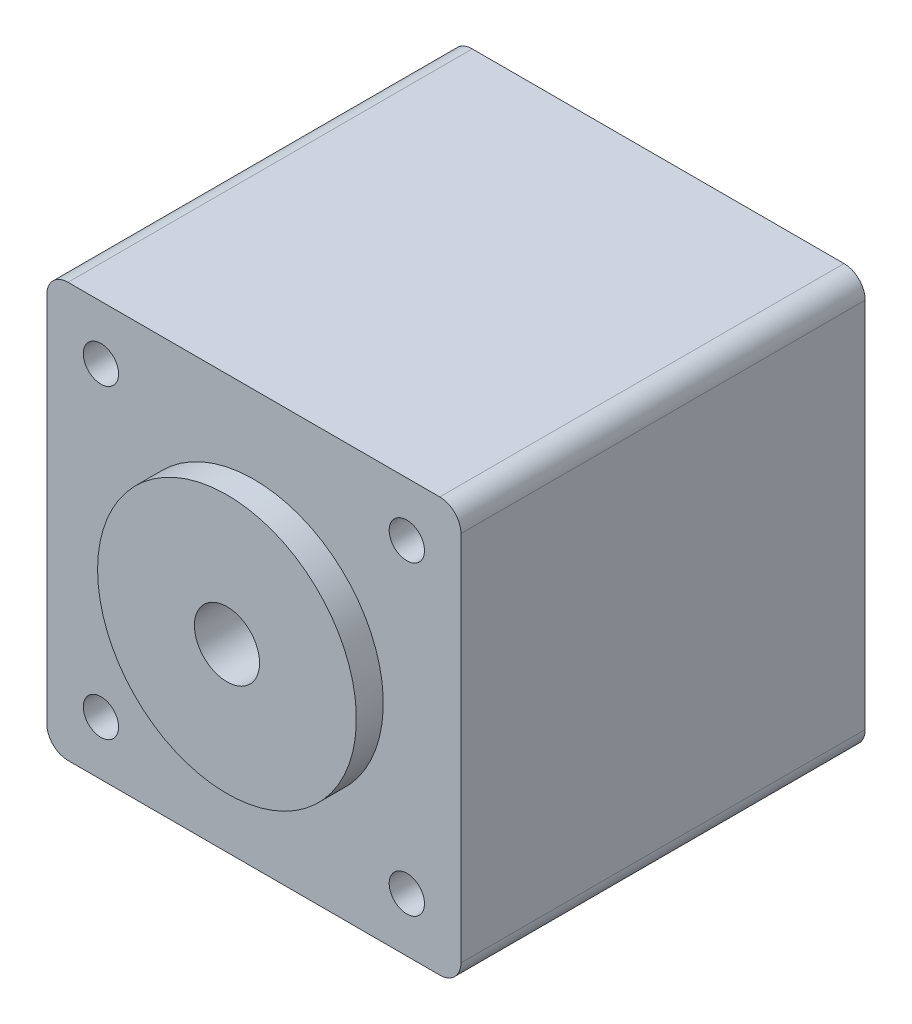
ISO-10303-21;
HEADER;
FILE_DESCRIPTION(('STEP AP214'),'2;1');
FILE_NAME('part.step','',(''),(''),'','','');
FILE_SCHEMA(('AUTOMOTIVE_DESIGN { 1 0 10303 214 1 1 1 1 }'));
ENDSEC;
DATA;
#1=APPLICATION_CONTEXT('core data for automotive mechanical design processes');
#2=APPLICATION_PROTOCOL_DEFINITION('international standard','automotive_design',2000,#1);
#3=PRODUCT_CONTEXT('',#1,'mechanical');
#4=PRODUCT('Part','Part','',(#3));
#5=PRODUCT_RELATED_PRODUCT_CATEGORY('part','',(#4));
#6=PRODUCT_DEFINITION_FORMATION('','',#4);
#7=PRODUCT_DEFINITION_CONTEXT('part definition',#1,'design');
#8=PRODUCT_DEFINITION('design','',#6,#7);
#9=PRODUCT_DEFINITION_SHAPE('','',#8);
#10=(LENGTH_UNIT() NAMED_UNIT(*) SI_UNIT(.MILLI.,.METRE.));
#11=(NAMED_UNIT(*) PLANE_ANGLE_UNIT() SI_UNIT($,.RADIAN.));
#12=(NAMED_UNIT(*) SI_UNIT($,.STERADIAN.) SOLID_ANGLE_UNIT());
#13=UNCERTAINTY_MEASURE_WITH_UNIT(LENGTH_MEASURE(1.E-05),#10,'distance_accuracy_value','');
#14=(GEOMETRIC_REPRESENTATION_CONTEXT(3) GLOBAL_UNCERTAINTY_ASSIGNED_CONTEXT((#13)) GLOBAL_UNIT_ASSIGNED_CONTEXT((#10,
#11,#12)) REPRESENTATION_CONTEXT('',''));
#15=CARTESIAN_POINT('',(0.,0.,0.));
#16=DIRECTION('',(0.,0.,1.));
#17=DIRECTION('',(1.,0.,0.));
#18=AXIS2_PLACEMENT_3D('',#15,#16,#17);
#19=CARTESIAN_POINT('',(-4.51548307073138,-24.425,-32.7865505037473));
#20=DIRECTION('',(0.,-1.,0.));
#21=DIRECTION('',(0.,0.,-1.));
#22=AXIS2_PLACEMENT_3D('',#19,#20,#21);
#23=PLANE('',#22);
#24=CARTESIAN_POINT('',(-0.499999999999994,-24.425,-29.61));
#25=DIRECTION('',(0.,1.,0.));
#26=DIRECTION('',(0.,0.,1.));
#27=AXIS2_PLACEMENT_3D('',#24,#25,#26);
#28=CIRCLE('',#27,0.634999999999997);
#29=CARTESIAN_POINT('',(-0.499999999999994,-24.425,-28.975));
#30=VERTEX_POINT('',#29);
#31=EDGE_CURVE('E20',#30,#30,#28,.T.);
#32=ORIENTED_EDGE('',*,*,#31,.F.);
#33=EDGE_LOOP('',(#32));
#34=FACE_BOUND('',#33,.T.);
#35=ADVANCED_FACE('F17',(#34),#23,.T.);
#36=CARTESIAN_POINT('',(-4.51548307073138,-24.425,-32.7865505037473));
#37=DIRECTION('',(0.,-1.,0.));
#38=DIRECTION('',(0.,0.,-1.));
#39=AXIS2_PLACEMENT_3D('',#36,#37,#38);
#40=PLANE('',#39);
#41=CARTESIAN_POINT('',(-1.49999999999999,-24.425,-28.61));
#42=DIRECTION('',(0.,1.,0.));
#43=DIRECTION('',(0.,0.,1.));
#44=AXIS2_PLACEMENT_3D('',#41,#42,#43);
#45=CIRCLE('',#44,0.634999999999997);
#46=CARTESIAN_POINT('',(-1.49999999999999,-24.425,-27.975));
#47=VERTEX_POINT('',#46);
#48=EDGE_CURVE('E225',#47,#47,#45,.T.);
#49=ORIENTED_EDGE('',*,*,#48,.F.);
#50=EDGE_LOOP('',(#49));
#51=FACE_BOUND('',#50,.T.);
#52=ADVANCED_FACE('F236',(#51),#40,.T.);
#53=CARTESIAN_POINT('',(-4.51548307073138,-24.425,-32.7865505037473));
#54=DIRECTION('',(0.,-1.,0.));
#55=DIRECTION('',(0.,0.,-1.));
#56=AXIS2_PLACEMENT_3D('',#53,#54,#55);
#57=PLANE('',#56);
#58=CARTESIAN_POINT('',(0.500000000000007,-24.425,-28.61));
#59=DIRECTION('',(0.,1.,0.));
#60=DIRECTION('',(0.,0.,1.));
#61=AXIS2_PLACEMENT_3D('',#58,#59,#60);
#62=CIRCLE('',#61,0.634999999999997);
#63=CARTESIAN_POINT('',(0.500000000000007,-24.425,-27.975));
#64=VERTEX_POINT('',#63);
#65=EDGE_CURVE('E223',#64,#64,#62,.T.);
#66=ORIENTED_EDGE('',*,*,#65,.F.);
#67=EDGE_LOOP('',(#66));
#68=FACE_BOUND('',#67,.T.);
#69=ADVANCED_FACE('F241',(#68),#57,.T.);
#70=CARTESIAN_POINT('',(-4.51548307073138,-24.425,-32.7865505037473));
#71=DIRECTION('',(0.,-1.,0.));
#72=DIRECTION('',(0.,0.,-1.));
#73=AXIS2_PLACEMENT_3D('',#70,#71,#72);
#74=PLANE('',#73);
#75=CARTESIAN_POINT('',(1.50000000000001,-24.425,-29.61));
#76=DIRECTION('',(0.,1.,0.));
#77=DIRECTION('',(0.,0.,1.));
#78=AXIS2_PLACEMENT_3D('',#75,#76,#77);
#79=CIRCLE('',#78,0.634999999999997);
#80=CARTESIAN_POINT('',(1.50000000000001,-24.425,-28.975));
#81=VERTEX_POINT('',#80);
#82=EDGE_CURVE('E220',#81,#81,#79,.T.);
#83=ORIENTED_EDGE('',*,*,#82,.F.);
#84=EDGE_LOOP('',(#83));
#85=FACE_BOUND('',#84,.T.);
#86=ADVANCED_FACE('F365',(#85),#74,.T.);
#87=CARTESIAN_POINT('',(-0.499999999999994,-39.425,-29.61));
#88=DIRECTION('',(0.,1.,0.));
#89=DIRECTION('',(0.,0.,1.));
#90=AXIS2_PLACEMENT_3D('',#87,#88,#89);
#91=CYLINDRICAL_SURFACE('',#90,0.634999999999997);
#92=ORIENTED_EDGE('',*,*,#31,.T.);
#93=EDGE_LOOP('',(#92));
#94=FACE_BOUND('',#93,.T.);
#95=CARTESIAN_POINT('',(-0.499999999999994,-14.425,-29.61));
#96=DIRECTION('',(0.,1.,0.));
#97=DIRECTION('',(0.,0.,1.));
#98=AXIS2_PLACEMENT_3D('',#95,#96,#97);
#99=CIRCLE('',#98,0.634999999999997);
#100=CARTESIAN_POINT('',(-0.499999999999994,-14.425,-28.975));
#101=VERTEX_POINT('',#100);
#102=EDGE_CURVE('E214',#101,#101,#99,.F.);
#103=ORIENTED_EDGE('',*,*,#102,.T.);
#104=EDGE_LOOP('',(#103));
#105=FACE_BOUND('',#104,.T.);
#106=ADVANCED_FACE('F232',(#94,#105),#91,.T.);
#107=CARTESIAN_POINT('',(-1.49999999999999,-39.425,-28.61));
#108=DIRECTION('',(0.,1.,0.));
#109=DIRECTION('',(0.,0.,1.));
#110=AXIS2_PLACEMENT_3D('',#107,#108,#109);
#111=CYLINDRICAL_SURFACE('',#110,0.634999999999997);
#112=ORIENTED_EDGE('',*,*,#48,.T.);
#113=EDGE_LOOP('',(#112));
#114=FACE_BOUND('',#113,.T.);
#115=CARTESIAN_POINT('',(-1.49999999999999,-14.425,-28.61));
#116=DIRECTION('',(0.,1.,0.));
#117=DIRECTION('',(0.,0.,1.));
#118=AXIS2_PLACEMENT_3D('',#115,#116,#117);
#119=CIRCLE('',#118,0.634999999999997);
#120=CARTESIAN_POINT('',(-1.49999999999999,-14.425,-27.975));
#121=VERTEX_POINT('',#120);
#122=EDGE_CURVE('E211',#121,#121,#119,.F.);
#123=ORIENTED_EDGE('',*,*,#122,.T.);
#124=EDGE_LOOP('',(#123));
#125=FACE_BOUND('',#124,.T.);
#126=ADVANCED_FACE('F359',(#114,#125),#111,.T.);
#127=CARTESIAN_POINT('',(0.500000000000007,-39.425,-28.61));
#128=DIRECTION('',(0.,1.,0.));
#129=DIRECTION('',(0.,0.,1.));
#130=AXIS2_PLACEMENT_3D('',#127,#128,#129);
#131=CYLINDRICAL_SURFACE('',#130,0.634999999999997);
#132=ORIENTED_EDGE('',*,*,#65,.T.);
#133=EDGE_LOOP('',(#132));
#134=FACE_BOUND('',#133,.T.);
#135=CARTESIAN_POINT('',(0.500000000000007,-14.425,-28.61));
#136=DIRECTION('',(0.,1.,0.));
#137=DIRECTION('',(0.,0.,1.));
#138=AXIS2_PLACEMENT_3D('',#135,#136,#137);
#139=CIRCLE('',#138,0.634999999999997);
#140=CARTESIAN_POINT('',(0.500000000000007,-14.425,-27.975));
#141=VERTEX_POINT('',#140);
#142=EDGE_CURVE('E208',#141,#141,#139,.F.);
#143=ORIENTED_EDGE('',*,*,#142,.T.);
#144=EDGE_LOOP('',(#143));
#145=FACE_BOUND('',#144,.T.);
#146=ADVANCED_FACE('F355',(#134,#145),#131,.T.);
#147=CARTESIAN_POINT('',(1.50000000000001,-39.425,-29.61));
#148=DIRECTION('',(0.,1.,0.));
#149=DIRECTION('',(0.,0.,1.));
#150=AXIS2_PLACEMENT_3D('',#147,#148,#149);
#151=CYLINDRICAL_SURFACE('',#150,0.634999999999997);
#152=ORIENTED_EDGE('',*,*,#82,.T.);
#153=EDGE_LOOP('',(#152));
#154=FACE_BOUND('',#153,.T.);
#155=CARTESIAN_POINT('',(1.50000000000001,-14.425,-29.61));
#156=DIRECTION('',(0.,1.,0.));
#157=DIRECTION('',(0.,0.,1.));
#158=AXIS2_PLACEMENT_3D('',#155,#156,#157);
#159=CIRCLE('',#158,0.634999999999997);
#160=CARTESIAN_POINT('',(1.50000000000001,-14.425,-28.975));
#161=VERTEX_POINT('',#160);
#162=EDGE_CURVE('E205',#161,#161,#159,.F.);
#163=ORIENTED_EDGE('',*,*,#162,.T.);
#164=EDGE_LOOP('',(#163));
#165=FACE_BOUND('',#164,.T.);
#166=ADVANCED_FACE('F351',(#154,#165),#151,.T.);
#167=CARTESIAN_POINT('',(-13.,-13.,-3.81));
#168=DIRECTION('',(0.,0.,1.));
#169=DIRECTION('',(1.,0.,0.));
#170=AXIS2_PLACEMENT_3D('',#167,#168,#169);
#171=PLANE('',#170);
#172=CARTESIAN_POINT('',(-13.,-13.,-3.81));
#173=DIRECTION('',(0.,0.,1.));
#174=DIRECTION('',(1.,0.,0.));
#175=AXIS2_PLACEMENT_3D('',#172,#173,#174);
#176=CIRCLE('',#175,1.5);
#177=CARTESIAN_POINT('',(-11.5,-13.,-3.81));
#178=VERTEX_POINT('',#177);
#179=EDGE_CURVE('E202',#178,#178,#176,.T.);
#180=ORIENTED_EDGE('',*,*,#179,.T.);
#181=EDGE_LOOP('',(#180));
#182=FACE_BOUND('',#181,.T.);
#183=ADVANCED_FACE('F347',(#182),#171,.T.);
#184=CARTESIAN_POINT('',(13.,-12.9999999999998,-3.81));
#185=DIRECTION('',(0.,0.,1.));
#186=DIRECTION('',(1.,0.,0.));
#187=AXIS2_PLACEMENT_3D('',#184,#185,#186);
#188=PLANE('',#187);
#189=CARTESIAN_POINT('',(13.,-12.9999999999998,-3.81));
#190=DIRECTION('',(0.,0.,1.));
#191=DIRECTION('',(1.,0.,0.));
#192=AXIS2_PLACEMENT_3D('',#189,#190,#191);
#193=CIRCLE('',#192,1.5);
#194=CARTESIAN_POINT('',(14.5,-12.9999999999998,-3.81));
#195=VERTEX_POINT('',#194);
#196=EDGE_CURVE('E199',#195,#195,#193,.T.);
#197=ORIENTED_EDGE('',*,*,#196,.T.);
#198=EDGE_LOOP('',(#197));
#199=FACE_BOUND('',#198,.T.);
#200=ADVANCED_FACE('F343',(#199),#188,.T.);
#201=CARTESIAN_POINT('',(13.,13.0000000000002,-3.81));
#202=DIRECTION('',(0.,0.,1.));
#203=DIRECTION('',(1.,0.,0.));
#204=AXIS2_PLACEMENT_3D('',#201,#202,#203);
#205=PLANE('',#204);
#206=CARTESIAN_POINT('',(13.,13.0000000000002,-3.81));
#207=DIRECTION('',(0.,0.,1.));
#208=DIRECTION('',(1.,0.,0.));
#209=AXIS2_PLACEMENT_3D('',#206,#207,#208);
#210=CIRCLE('',#209,1.5);
#211=CARTESIAN_POINT('',(14.5,13.0000000000002,-3.81));
#212=VERTEX_POINT('',#211);
#213=EDGE_CURVE('E196',#212,#212,#210,.T.);
#214=ORIENTED_EDGE('',*,*,#213,.T.);
#215=EDGE_LOOP('',(#214));
#216=FACE_BOUND('',#215,.T.);
#217=ADVANCED_FACE('F339',(#216),#205,.T.);
#218=CARTESIAN_POINT('',(-13.,13.,-3.81));
#219=DIRECTION('',(0.,0.,1.));
#220=DIRECTION('',(1.,0.,0.));
#221=AXIS2_PLACEMENT_3D('',#218,#219,#220);
#222=PLANE('',#221);
#223=CARTESIAN_POINT('',(-13.,13.,-3.81));
#224=DIRECTION('',(0.,0.,1.));
#225=DIRECTION('',(1.,0.,0.));
#226=AXIS2_PLACEMENT_3D('',#223,#224,#225);
#227=CIRCLE('',#226,1.5);
#228=CARTESIAN_POINT('',(-11.5,13.,-3.81));
#229=VERTEX_POINT('',#228);
#230=EDGE_CURVE('E193',#229,#229,#227,.T.);
#231=ORIENTED_EDGE('',*,*,#230,.T.);
#232=EDGE_LOOP('',(#231));
#233=FACE_BOUND('',#232,.T.);
#234=ADVANCED_FACE('F335',(#233),#222,.T.);
#235=CARTESIAN_POINT('',(0.,0.,2.286));
#236=DIRECTION('',(0.,0.,1.));
#237=DIRECTION('',(1.,0.,0.));
#238=AXIS2_PLACEMENT_3D('',#235,#236,#237);
#239=PLANE('',#238);
#240=CARTESIAN_POINT('',(0.,0.,2.286));
#241=DIRECTION('',(0.,0.,1.));
#242=DIRECTION('',(1.,0.,0.));
#243=AXIS2_PLACEMENT_3D('',#240,#241,#242);
#244=CIRCLE('',#243,2.7686);
#245=CARTESIAN_POINT('',(2.7686,0.,2.286));
#246=VERTEX_POINT('',#245);
#247=EDGE_CURVE('E217',#246,#246,#244,.F.);
#248=ORIENTED_EDGE('',*,*,#247,.T.);
#249=EDGE_LOOP('',(#248));
#250=FACE_BOUND('',#249,.T.);
#251=CARTESIAN_POINT('',(0.,0.,2.286));
#252=DIRECTION('',(0.,0.,-1.));
#253=DIRECTION('',(-1.,0.,0.));
#254=AXIS2_PLACEMENT_3D('',#251,#252,#253);
#255=CIRCLE('',#254,10.9982);
#256=CARTESIAN_POINT('',(-10.9982,0.,2.286));
#257=VERTEX_POINT('',#256);
#258=EDGE_CURVE('E190',#257,#257,#255,.T.);
#259=ORIENTED_EDGE('',*,*,#258,.F.);
#260=EDGE_LOOP('',(#259));
#261=FACE_BOUND('',#260,.T.);
#262=ADVANCED_FACE('F331',(#250,#261),#239,.T.);
#263=CARTESIAN_POINT('',(0.,0.,-34.36));
#264=DIRECTION('',(0.,0.,1.));
#265=DIRECTION('',(1.,0.,0.));
#266=AXIS2_PLACEMENT_3D('',#263,#264,#265);
#267=CYLINDRICAL_SURFACE('',#266,2.7686);
#268=ORIENTED_EDGE('',*,*,#247,.F.);
#269=EDGE_LOOP('',(#268));
#270=FACE_BOUND('',#269,.T.);
#271=CARTESIAN_POINT('',(0.,0.,-32.36));
#272=DIRECTION('',(0.,0.,1.));
#273=DIRECTION('',(1.,0.,0.));
#274=AXIS2_PLACEMENT_3D('',#271,#272,#273);
#275=CIRCLE('',#274,2.7686);
#276=CARTESIAN_POINT('',(2.7686,0.,-32.36));
#277=VERTEX_POINT('',#276);
#278=EDGE_CURVE('E118',#277,#277,#275,.T.);
#279=ORIENTED_EDGE('',*,*,#278,.F.);
#280=EDGE_LOOP('',(#279));
#281=FACE_BOUND('',#280,.T.);
#282=ADVANCED_FACE('F327',(#270,#281),#267,.F.);
#283=CARTESIAN_POINT('',(-2.25,-14.425,-27.36));
#284=DIRECTION('',(0.,1.,0.));
#285=DIRECTION('',(0.,0.,1.));
#286=AXIS2_PLACEMENT_3D('',#283,#284,#285);
#287=PLANE('',#286);
#288=ORIENTED_EDGE('',*,*,#162,.F.);
#289=EDGE_LOOP('',(#288));
#290=FACE_BOUND('',#289,.T.);
#291=ORIENTED_EDGE('',*,*,#142,.F.);
#292=EDGE_LOOP('',(#291));
#293=FACE_BOUND('',#292,.T.);
#294=DIRECTION('',(-1.,0.,0.));
#295=VECTOR('',#294,1.);
#296=CARTESIAN_POINT('',(-2.25,-14.425,-30.86));
#297=LINE('',#296,#295);
#298=CARTESIAN_POINT('',(-2.25,-14.425,-30.86));
#299=VERTEX_POINT('',#298);
#300=CARTESIAN_POINT('',(2.25000000000001,-14.425,-30.86));
#301=VERTEX_POINT('',#300);
#302=EDGE_CURVE('E650',#299,#301,#297,.F.);
#303=ORIENTED_EDGE('',*,*,#302,.T.);
#304=DIRECTION('',(0.,0.,-1.));
#305=VECTOR('',#304,1.);
#306=CARTESIAN_POINT('',(2.25000000000001,-14.425,-30.86));
#307=LINE('',#306,#305);
#308=CARTESIAN_POINT('',(2.25000000000001,-14.425,-27.36));
#309=VERTEX_POINT('',#308);
#310=EDGE_CURVE('E90',#301,#309,#307,.F.);
#311=ORIENTED_EDGE('',*,*,#310,.T.);
#312=DIRECTION('',(1.,0.,0.));
#313=VECTOR('',#312,1.);
#314=CARTESIAN_POINT('',(-2.25,-14.425,-27.36));
#315=LINE('',#314,#313);
#316=CARTESIAN_POINT('',(-2.25,-14.425,-27.36));
#317=VERTEX_POINT('',#316);
#318=EDGE_CURVE('E117',#309,#317,#315,.F.);
#319=ORIENTED_EDGE('',*,*,#318,.T.);
#320=DIRECTION('',(0.,0.,1.));
#321=VECTOR('',#320,1.);
#322=CARTESIAN_POINT('',(-2.25,-14.425,-30.86));
#323=LINE('',#322,#321);
#324=EDGE_CURVE('E105',#317,#299,#323,.F.);
#325=ORIENTED_EDGE('',*,*,#324,.T.);
#326=EDGE_LOOP('',(#303,#311,#319,#325));
#327=FACE_BOUND('',#326,.T.);
#328=ORIENTED_EDGE('',*,*,#122,.F.);
#329=EDGE_LOOP('',(#328));
#330=FACE_BOUND('',#329,.T.);
#331=ORIENTED_EDGE('',*,*,#102,.F.);
#332=EDGE_LOOP('',(#331));
#333=FACE_BOUND('',#332,.T.);
#334=ADVANCED_FACE('F126',(#290,#293,#327,#330,#333),#287,.F.);
#335=CARTESIAN_POINT('',(-13.,-13.,-3.81));
#336=DIRECTION('',(0.,0.,1.));
#337=DIRECTION('',(1.,0.,0.));
#338=AXIS2_PLACEMENT_3D('',#335,#336,#337);
#339=CYLINDRICAL_SURFACE('',#338,1.5);
#340=CARTESIAN_POINT('',(-13.,-13.,0.));
#341=DIRECTION('',(0.,0.,1.));
#342=DIRECTION('',(1.,0.,0.));
#343=AXIS2_PLACEMENT_3D('',#340,#341,#342);
#344=CIRCLE('',#343,1.5);
#345=CARTESIAN_POINT('',(-11.5,-13.,0.));
#346=VERTEX_POINT('',#345);
#347=EDGE_CURVE('E184',#346,#346,#344,.F.);
#348=ORIENTED_EDGE('',*,*,#347,.F.);
#349=EDGE_LOOP('',(#348));
#350=FACE_BOUND('',#349,.T.);
#351=ORIENTED_EDGE('',*,*,#179,.F.);
#352=EDGE_LOOP('',(#351));
#353=FACE_BOUND('',#352,.T.);
#354=ADVANCED_FACE('F320',(#350,#353),#339,.F.);
#355=CARTESIAN_POINT('',(13.,-12.9999999999998,-3.81));
#356=DIRECTION('',(0.,0.,1.));
#357=DIRECTION('',(1.,0.,0.));
#358=AXIS2_PLACEMENT_3D('',#355,#356,#357);
#359=CYLINDRICAL_SURFACE('',#358,1.5);
#360=CARTESIAN_POINT('',(13.,-12.9999999999998,0.));
#361=DIRECTION('',(0.,0.,1.));
#362=DIRECTION('',(1.,0.,0.));
#363=AXIS2_PLACEMENT_3D('',#360,#361,#362);
#364=CIRCLE('',#363,1.5);
#365=CARTESIAN_POINT('',(14.5,-12.9999999999998,0.));
#366=VERTEX_POINT('',#365);
#367=EDGE_CURVE('E181',#366,#366,#364,.F.);
#368=ORIENTED_EDGE('',*,*,#367,.F.);
#369=EDGE_LOOP('',(#368));
#370=FACE_BOUND('',#369,.T.);
#371=ORIENTED_EDGE('',*,*,#196,.F.);
#372=EDGE_LOOP('',(#371));
#373=FACE_BOUND('',#372,.T.);
#374=ADVANCED_FACE('F316',(#370,#373),#359,.F.);
#375=CARTESIAN_POINT('',(13.,13.0000000000002,-3.81));
#376=DIRECTION('',(0.,0.,1.));
#377=DIRECTION('',(1.,0.,0.));
#378=AXIS2_PLACEMENT_3D('',#375,#376,#377);
#379=CYLINDRICAL_SURFACE('',#378,1.5);
#380=CARTESIAN_POINT('',(13.,13.0000000000002,0.));
#381=DIRECTION('',(0.,0.,1.));
#382=DIRECTION('',(1.,0.,0.));
#383=AXIS2_PLACEMENT_3D('',#380,#381,#382);
#384=CIRCLE('',#383,1.5);
#385=CARTESIAN_POINT('',(14.5,13.0000000000002,0.));
#386=VERTEX_POINT('',#385);
#387=EDGE_CURVE('E178',#386,#386,#384,.F.);
#388=ORIENTED_EDGE('',*,*,#387,.F.);
#389=EDGE_LOOP('',(#388));
#390=FACE_BOUND('',#389,.T.);
#391=ORIENTED_EDGE('',*,*,#213,.F.);
#392=EDGE_LOOP('',(#391));
#393=FACE_BOUND('',#392,.T.);
#394=ADVANCED_FACE('F312',(#390,#393),#379,.F.);
#395=CARTESIAN_POINT('',(-13.,13.,-3.81));
#396=DIRECTION('',(0.,0.,1.));
#397=DIRECTION('',(1.,0.,0.));
#398=AXIS2_PLACEMENT_3D('',#395,#396,#397);
#399=CYLINDRICAL_SURFACE('',#398,1.5);
#400=CARTESIAN_POINT('',(-13.,13.,0.));
#401=DIRECTION('',(0.,0.,1.));
#402=DIRECTION('',(1.,0.,0.));
#403=AXIS2_PLACEMENT_3D('',#400,#401,#402);
#404=CIRCLE('',#403,1.5);
#405=CARTESIAN_POINT('',(-11.5,13.,0.));
#406=VERTEX_POINT('',#405);
#407=EDGE_CURVE('E175',#406,#406,#404,.F.);
#408=ORIENTED_EDGE('',*,*,#407,.F.);
#409=EDGE_LOOP('',(#408));
#410=FACE_BOUND('',#409,.T.);
#411=ORIENTED_EDGE('',*,*,#230,.F.);
#412=EDGE_LOOP('',(#411));
#413=FACE_BOUND('',#412,.T.);
#414=ADVANCED_FACE('F308',(#410,#413),#399,.F.);
#415=CARTESIAN_POINT('',(0.,0.,2.286));
#416=DIRECTION('',(0.,0.,-1.));
#417=DIRECTION('',(-1.,0.,0.));
#418=AXIS2_PLACEMENT_3D('',#415,#416,#417);
#419=CYLINDRICAL_SURFACE('',#418,10.9982);
#420=CARTESIAN_POINT('',(0.,0.,0.));
#421=DIRECTION('',(0.,0.,-1.));
#422=DIRECTION('',(-1.,0.,0.));
#423=AXIS2_PLACEMENT_3D('',#420,#421,#422);
#424=CIRCLE('',#423,10.9982);
#425=CARTESIAN_POINT('',(-10.9982,0.,0.));
#426=VERTEX_POINT('',#425);
#427=EDGE_CURVE('E172',#426,#426,#424,.T.);
#428=ORIENTED_EDGE('',*,*,#427,.F.);
#429=EDGE_LOOP('',(#428));
#430=FACE_BOUND('',#429,.T.);
#431=ORIENTED_EDGE('',*,*,#258,.T.);
#432=EDGE_LOOP('',(#431));
#433=FACE_BOUND('',#432,.T.);
#434=ADVANCED_FACE('F304',(#430,#433),#419,.T.);
#435=CARTESIAN_POINT('',(0.,0.,-32.36));
#436=DIRECTION('',(0.,0.,-1.));
#437=DIRECTION('',(-1.,0.,0.));
#438=AXIS2_PLACEMENT_3D('',#435,#436,#437);
#439=PLANE('',#438);
#440=ORIENTED_EDGE('',*,*,#278,.T.);
#441=EDGE_LOOP('',(#440));
#442=FACE_BOUND('',#441,.T.);
#443=CARTESIAN_POINT('',(0.,0.,-32.36));
#444=DIRECTION('',(0.,0.,-1.));
#445=DIRECTION('',(-1.,0.,0.));
#446=AXIS2_PLACEMENT_3D('',#443,#444,#445);
#447=CIRCLE('',#446,4.5);
#448=CARTESIAN_POINT('',(-4.5,0.,-32.36));
#449=VERTEX_POINT('',#448);
#450=EDGE_CURVE('E169',#449,#449,#447,.T.);
#451=ORIENTED_EDGE('',*,*,#450,.T.);
#452=EDGE_LOOP('',(#451));
#453=FACE_BOUND('',#452,.T.);
#454=ADVANCED_FACE('F301',(#442,#453),#439,.T.);
#455=CARTESIAN_POINT('',(-2.25,-14.425,-30.86));
#456=DIRECTION('',(-1.,0.,0.));
#457=DIRECTION('',(0.,0.,1.));
#458=AXIS2_PLACEMENT_3D('',#455,#456,#457);
#459=PLANE('',#458);
#460=DIRECTION('',(0.,1.,0.));
#461=VECTOR('',#460,1.);
#462=CARTESIAN_POINT('',(-2.25,-14.425,-30.86));
#463=LINE('',#462,#461);
#464=CARTESIAN_POINT('',(-2.25,-17.6,-30.86));
#465=VERTEX_POINT('',#464);
#466=EDGE_CURVE('E112',#465,#299,#463,.T.);
#467=ORIENTED_EDGE('',*,*,#466,.T.);
#468=ORIENTED_EDGE('',*,*,#324,.F.);
#469=DIRECTION('',(0.,1.,0.));
#470=VECTOR('',#469,1.);
#471=CARTESIAN_POINT('',(-2.25,-14.425,-27.36));
#472=LINE('',#471,#470);
#473=CARTESIAN_POINT('',(-2.25,-17.6,-27.36));
#474=VERTEX_POINT('',#473);
#475=EDGE_CURVE('E109',#317,#474,#472,.F.);
#476=ORIENTED_EDGE('',*,*,#475,.T.);
#477=DIRECTION('',(0.,0.,-1.));
#478=VECTOR('',#477,1.);
#479=CARTESIAN_POINT('',(-2.25,-17.6,-34.36));
#480=LINE('',#479,#478);
#481=EDGE_CURVE('E665',#465,#474,#480,.F.);
#482=ORIENTED_EDGE('',*,*,#481,.F.);
#483=EDGE_LOOP('',(#467,#468,#476,#482));
#484=FACE_BOUND('',#483,.T.);
#485=ADVANCED_FACE('F107',(#484),#459,.F.);
#486=CARTESIAN_POINT('',(-2.25,-14.425,-27.36));
#487=DIRECTION('',(0.,0.,1.));
#488=DIRECTION('',(1.,0.,0.));
#489=AXIS2_PLACEMENT_3D('',#486,#487,#488);
#490=PLANE('',#489);
#491=ORIENTED_EDGE('',*,*,#475,.F.);
#492=ORIENTED_EDGE('',*,*,#318,.F.);
#493=DIRECTION('',(0.,1.,0.));
#494=VECTOR('',#493,1.);
#495=CARTESIAN_POINT('',(2.25000000000001,-14.425,-27.36));
#496=LINE('',#495,#494);
#497=CARTESIAN_POINT('',(2.25000000000001,-17.6,-27.36));
#498=VERTEX_POINT('',#497);
#499=EDGE_CURVE('E653',#309,#498,#496,.F.);
#500=ORIENTED_EDGE('',*,*,#499,.T.);
#501=DIRECTION('',(1.,0.,0.));
#502=VECTOR('',#501,1.);
#503=CARTESIAN_POINT('',(-17.6,-17.6,-27.36));
#504=LINE('',#503,#502);
#505=EDGE_CURVE('E124',#474,#498,#504,.T.);
#506=ORIENTED_EDGE('',*,*,#505,.F.);
#507=EDGE_LOOP('',(#491,#492,#500,#506));
#508=FACE_BOUND('',#507,.T.);
#509=ADVANCED_FACE('F121',(#508),#490,.F.);
#510=CARTESIAN_POINT('',(2.25000000000001,-14.425,-30.86));
#511=DIRECTION('',(1.,0.,0.));
#512=DIRECTION('',(0.,0.,-1.));
#513=AXIS2_PLACEMENT_3D('',#510,#511,#512);
#514=PLANE('',#513);
#515=ORIENTED_EDGE('',*,*,#499,.F.);
#516=ORIENTED_EDGE('',*,*,#310,.F.);
#517=DIRECTION('',(0.,1.,0.));
#518=VECTOR('',#517,1.);
#519=CARTESIAN_POINT('',(2.25000000000001,-14.425,-30.86));
#520=LINE('',#519,#518);
#521=CARTESIAN_POINT('',(2.25000000000001,-17.6,-30.86));
#522=VERTEX_POINT('',#521);
#523=EDGE_CURVE('E187',#301,#522,#520,.F.);
#524=ORIENTED_EDGE('',*,*,#523,.T.);
#525=DIRECTION('',(0.,0.,-1.));
#526=VECTOR('',#525,1.);
#527=CARTESIAN_POINT('',(2.25000000000001,-17.6,-34.36));
#528=LINE('',#527,#526);
#529=EDGE_CURVE('E659',#498,#522,#528,.T.);
#530=ORIENTED_EDGE('',*,*,#529,.F.);
#531=EDGE_LOOP('',(#515,#516,#524,#530));
#532=FACE_BOUND('',#531,.T.);
#533=ADVANCED_FACE('F293',(#532),#514,.F.);
#534=CARTESIAN_POINT('',(-2.25,-14.425,-30.86));
#535=DIRECTION('',(0.,0.,-1.));
#536=DIRECTION('',(-1.,0.,0.));
#537=AXIS2_PLACEMENT_3D('',#534,#535,#536);
#538=PLANE('',#537);
#539=ORIENTED_EDGE('',*,*,#523,.F.);
#540=ORIENTED_EDGE('',*,*,#302,.F.);
#541=ORIENTED_EDGE('',*,*,#466,.F.);
#542=DIRECTION('',(1.,0.,0.));
#543=VECTOR('',#542,1.);
#544=CARTESIAN_POINT('',(-17.6,-17.6,-30.86));
#545=LINE('',#544,#543);
#546=EDGE_CURVE('E648',#522,#465,#545,.F.);
#547=ORIENTED_EDGE('',*,*,#546,.F.);
#548=EDGE_LOOP('',(#539,#540,#541,#547));
#549=FACE_BOUND('',#548,.T.);
#550=ADVANCED_FACE('F289',(#549),#538,.F.);
#551=CARTESIAN_POINT('',(-17.6,-17.6,0.));
#552=DIRECTION('',(0.,0.,1.));
#553=DIRECTION('',(1.,0.,0.));
#554=AXIS2_PLACEMENT_3D('',#551,#552,#553);
#555=PLANE('',#554);
#556=ORIENTED_EDGE('',*,*,#427,.T.);
#557=EDGE_LOOP('',(#556));
#558=FACE_BOUND('',#557,.T.);
#559=DIRECTION('',(1.,0.,0.));
#560=VECTOR('',#559,1.);
#561=CARTESIAN_POINT('',(-17.6,17.6,0.));
#562=LINE('',#561,#560);
#563=CARTESIAN_POINT('',(-15.8,17.6,0.));
#564=VERTEX_POINT('',#563);
#565=CARTESIAN_POINT('',(15.8,17.6,0.));
#566=VERTEX_POINT('',#565);
#567=EDGE_CURVE('E135',#564,#566,#562,.T.);
#568=ORIENTED_EDGE('',*,*,#567,.F.);
#569=CARTESIAN_POINT('',(-15.8,15.8,0.));
#570=DIRECTION('',(0.,0.,1.));
#571=DIRECTION('',(1.,0.,0.));
#572=AXIS2_PLACEMENT_3D('',#569,#570,#571);
#573=CIRCLE('',#572,1.8);
#574=CARTESIAN_POINT('',(-17.6,15.8,0.));
#575=VERTEX_POINT('',#574);
#576=EDGE_CURVE('E163',#575,#564,#573,.F.);
#577=ORIENTED_EDGE('',*,*,#576,.F.);
#578=DIRECTION('',(0.,-1.,0.));
#579=VECTOR('',#578,1.);
#580=CARTESIAN_POINT('',(-17.6,17.6,0.));
#581=LINE('',#580,#579);
#582=CARTESIAN_POINT('',(-17.6,-15.8,0.));
#583=VERTEX_POINT('',#582);
#584=EDGE_CURVE('E131',#583,#575,#581,.F.);
#585=ORIENTED_EDGE('',*,*,#584,.F.);
#586=CARTESIAN_POINT('',(-15.8,-15.8,0.));
#587=DIRECTION('',(0.,0.,1.));
#588=DIRECTION('',(1.,0.,0.));
#589=AXIS2_PLACEMENT_3D('',#586,#587,#588);
#590=CIRCLE('',#589,1.8);
#591=CARTESIAN_POINT('',(-15.8,-17.6,0.));
#592=VERTEX_POINT('',#591);
#593=EDGE_CURVE('E160',#592,#583,#590,.F.);
#594=ORIENTED_EDGE('',*,*,#593,.F.);
#595=DIRECTION('',(1.,0.,0.));
#596=VECTOR('',#595,1.);
#597=CARTESIAN_POINT('',(-17.6,-17.6,0.));
#598=LINE('',#597,#596);
#599=CARTESIAN_POINT('',(15.8,-17.6,0.));
#600=VERTEX_POINT('',#599);
#601=EDGE_CURVE('E646',#600,#592,#598,.F.);
#602=ORIENTED_EDGE('',*,*,#601,.F.);
#603=CARTESIAN_POINT('',(15.8,-15.7999999999998,0.));
#604=DIRECTION('',(0.,0.,1.));
#605=DIRECTION('',(1.,0.,0.));
#606=AXIS2_PLACEMENT_3D('',#603,#604,#605);
#607=CIRCLE('',#606,1.8);
#608=CARTESIAN_POINT('',(17.6,-15.7999999999998,0.));
#609=VERTEX_POINT('',#608);
#610=EDGE_CURVE('E141',#609,#600,#607,.F.);
#611=ORIENTED_EDGE('',*,*,#610,.F.);
#612=DIRECTION('',(0.,1.,0.));
#613=VECTOR('',#612,1.);
#614=CARTESIAN_POINT('',(17.6,17.6000000000002,0.));
#615=LINE('',#614,#613);
#616=CARTESIAN_POINT('',(17.6,15.8000000000002,0.));
#617=VERTEX_POINT('',#616);
#618=EDGE_CURVE('E81',#617,#609,#615,.F.);
#619=ORIENTED_EDGE('',*,*,#618,.F.);
#620=CARTESIAN_POINT('',(15.8,15.8000000000002,0.));
#621=DIRECTION('',(0.,0.,1.));
#622=DIRECTION('',(1.,0.,0.));
#623=AXIS2_PLACEMENT_3D('',#620,#621,#622);
#624=CIRCLE('',#623,1.8);
#625=EDGE_CURVE('E165',#566,#617,#624,.F.);
#626=ORIENTED_EDGE('',*,*,#625,.F.);
#627=EDGE_LOOP('',(#568,#577,#585,#594,#602,#611,#619,#626));
#628=FACE_BOUND('',#627,.T.);
#629=ORIENTED_EDGE('',*,*,#407,.T.);
#630=EDGE_LOOP('',(#629));
#631=FACE_BOUND('',#630,.T.);
#632=ORIENTED_EDGE('',*,*,#387,.T.);
#633=EDGE_LOOP('',(#632));
#634=FACE_BOUND('',#633,.T.);
#635=ORIENTED_EDGE('',*,*,#367,.T.);
#636=EDGE_LOOP('',(#635));
#637=FACE_BOUND('',#636,.T.);
#638=ORIENTED_EDGE('',*,*,#347,.T.);
#639=EDGE_LOOP('',(#638));
#640=FACE_BOUND('',#639,.T.);
#641=ADVANCED_FACE('F285',(#558,#628,#631,#634,#637,#640),#555,.T.);
#642=CARTESIAN_POINT('',(0.,0.,-32.36));
#643=DIRECTION('',(0.,0.,-1.));
#644=DIRECTION('',(-1.,0.,0.));
#645=AXIS2_PLACEMENT_3D('',#642,#643,#644);
#646=CYLINDRICAL_SURFACE('',#645,4.5);
#647=ORIENTED_EDGE('',*,*,#450,.F.);
#648=EDGE_LOOP('',(#647));
#649=FACE_BOUND('',#648,.T.);
#650=CARTESIAN_POINT('',(0.,0.,-34.36));
#651=DIRECTION('',(0.,0.,-1.));
#652=DIRECTION('',(-1.,0.,0.));
#653=AXIS2_PLACEMENT_3D('',#650,#651,#652);
#654=CIRCLE('',#653,4.5);
#655=CARTESIAN_POINT('',(-4.5,0.,-34.36));
#656=VERTEX_POINT('',#655);
#657=EDGE_CURVE('E156',#656,#656,#654,.T.);
#658=ORIENTED_EDGE('',*,*,#657,.T.);
#659=EDGE_LOOP('',(#658));
#660=FACE_BOUND('',#659,.T.);
#661=ADVANCED_FACE('F281',(#649,#660),#646,.F.);
#662=CARTESIAN_POINT('',(15.8,-15.7999999999998,-34.36));
#663=DIRECTION('',(0.,0.,1.));
#664=DIRECTION('',(1.,0.,0.));
#665=AXIS2_PLACEMENT_3D('',#662,#663,#664);
#666=CYLINDRICAL_SURFACE('',#665,1.8);
#667=ORIENTED_EDGE('',*,*,#610,.T.);
#668=DIRECTION('',(0.,0.,-1.));
#669=VECTOR('',#668,1.);
#670=CARTESIAN_POINT('',(15.8,-17.6,-34.36));
#671=LINE('',#670,#669);
#672=CARTESIAN_POINT('',(15.8,-17.6,-34.36));
#673=VERTEX_POINT('',#672);
#674=EDGE_CURVE('E159',#673,#600,#671,.F.);
#675=ORIENTED_EDGE('',*,*,#674,.F.);
#676=CARTESIAN_POINT('',(15.8,-15.7999999999998,-34.36));
#677=DIRECTION('',(0.,0.,1.));
#678=DIRECTION('',(1.,0.,0.));
#679=AXIS2_PLACEMENT_3D('',#676,#677,#678);
#680=CIRCLE('',#679,1.8);
#681=CARTESIAN_POINT('',(17.6,-15.7999999999998,-34.36));
#682=VERTEX_POINT('',#681);
#683=EDGE_CURVE('E153',#673,#682,#680,.T.);
#684=ORIENTED_EDGE('',*,*,#683,.T.);
#685=DIRECTION('',(0.,0.,1.));
#686=VECTOR('',#685,1.);
#687=CARTESIAN_POINT('',(17.6,-15.7999999999998,-34.36));
#688=LINE('',#687,#686);
#689=EDGE_CURVE('E140',#609,#682,#688,.F.);
#690=ORIENTED_EDGE('',*,*,#689,.F.);
#691=EDGE_LOOP('',(#667,#675,#684,#690));
#692=FACE_BOUND('',#691,.T.);
#693=ADVANCED_FACE('F278',(#692),#666,.T.);
#694=CARTESIAN_POINT('',(17.6,17.6000000000002,-34.36));
#695=DIRECTION('',(1.,0.,0.));
#696=DIRECTION('',(0.,1.,0.));
#697=AXIS2_PLACEMENT_3D('',#694,#695,#696);
#698=PLANE('',#697);
#699=DIRECTION('',(0.,1.,0.));
#700=VECTOR('',#699,1.);
#701=CARTESIAN_POINT('',(17.6,-17.6,-34.36));
#702=LINE('',#701,#700);
#703=CARTESIAN_POINT('',(17.6,15.8000000000002,-34.36));
#704=VERTEX_POINT('',#703);
#705=EDGE_CURVE('E152',#682,#704,#702,.T.);
#706=ORIENTED_EDGE('',*,*,#705,.T.);
#707=DIRECTION('',(0.,0.,1.));
#708=VECTOR('',#707,1.);
#709=CARTESIAN_POINT('',(17.6,15.8000000000002,-34.36));
#710=LINE('',#709,#708);
#711=EDGE_CURVE('E138',#617,#704,#710,.F.);
#712=ORIENTED_EDGE('',*,*,#711,.F.);
#713=ORIENTED_EDGE('',*,*,#618,.T.);
#714=ORIENTED_EDGE('',*,*,#689,.T.);
#715=EDGE_LOOP('',(#706,#712,#713,#714));
#716=FACE_BOUND('',#715,.T.);
#717=ADVANCED_FACE('F274',(#716),#698,.T.);
#718=CARTESIAN_POINT('',(15.8,15.8000000000002,-34.36));
#719=DIRECTION('',(0.,0.,1.));
#720=DIRECTION('',(1.,0.,0.));
#721=AXIS2_PLACEMENT_3D('',#718,#719,#720);
#722=CYLINDRICAL_SURFACE('',#721,1.8);
#723=ORIENTED_EDGE('',*,*,#625,.T.);
#724=ORIENTED_EDGE('',*,*,#711,.T.);
#725=CARTESIAN_POINT('',(15.8,15.8000000000002,-34.36));
#726=DIRECTION('',(0.,0.,1.));
#727=DIRECTION('',(1.,0.,0.));
#728=AXIS2_PLACEMENT_3D('',#725,#726,#727);
#729=CIRCLE('',#728,1.8);
#730=CARTESIAN_POINT('',(15.8,17.6000000000001,-34.36));
#731=VERTEX_POINT('',#730);
#732=EDGE_CURVE('E149',#704,#731,#729,.T.);
#733=ORIENTED_EDGE('',*,*,#732,.T.);
#734=DIRECTION('',(0.,0.,1.));
#735=VECTOR('',#734,1.);
#736=CARTESIAN_POINT('',(15.8,17.6,-34.36));
#737=LINE('',#736,#735);
#738=EDGE_CURVE('E137',#566,#731,#737,.F.);
#739=ORIENTED_EDGE('',*,*,#738,.F.);
#740=EDGE_LOOP('',(#723,#724,#733,#739));
#741=FACE_BOUND('',#740,.T.);
#742=ADVANCED_FACE('F270',(#741),#722,.T.);
#743=CARTESIAN_POINT('',(-17.6,17.6,-34.36));
#744=DIRECTION('',(0.,1.,0.));
#745=DIRECTION('',(0.,0.,1.));
#746=AXIS2_PLACEMENT_3D('',#743,#744,#745);
#747=PLANE('',#746);
#748=ORIENTED_EDGE('',*,*,#567,.T.);
#749=ORIENTED_EDGE('',*,*,#738,.T.);
#750=DIRECTION('',(1.,0.,0.));
#751=VECTOR('',#750,1.);
#752=CARTESIAN_POINT('',(-17.6,17.6000000000002,-34.36));
#753=LINE('',#752,#751);
#754=CARTESIAN_POINT('',(-15.8,17.6000000000001,-34.36));
#755=VERTEX_POINT('',#754);
#756=EDGE_CURVE('E148',#731,#755,#753,.F.);
#757=ORIENTED_EDGE('',*,*,#756,.T.);
#758=DIRECTION('',(0.,0.,1.));
#759=VECTOR('',#758,1.);
#760=CARTESIAN_POINT('',(-15.8,17.6,-34.36));
#761=LINE('',#760,#759);
#762=EDGE_CURVE('E134',#564,#755,#761,.F.);
#763=ORIENTED_EDGE('',*,*,#762,.F.);
#764=EDGE_LOOP('',(#748,#749,#757,#763));
#765=FACE_BOUND('',#764,.T.);
#766=ADVANCED_FACE('F266',(#765),#747,.T.);
#767=CARTESIAN_POINT('',(-15.8,15.8,-34.36));
#768=DIRECTION('',(0.,0.,1.));
#769=DIRECTION('',(1.,0.,0.));
#770=AXIS2_PLACEMENT_3D('',#767,#768,#769);
#771=CYLINDRICAL_SURFACE('',#770,1.8);
#772=ORIENTED_EDGE('',*,*,#576,.T.);
#773=ORIENTED_EDGE('',*,*,#762,.T.);
#774=CARTESIAN_POINT('',(-15.8,15.8,-34.36));
#775=DIRECTION('',(0.,0.,1.));
#776=DIRECTION('',(1.,0.,0.));
#777=AXIS2_PLACEMENT_3D('',#774,#775,#776);
#778=CIRCLE('',#777,1.8);
#779=CARTESIAN_POINT('',(-17.6,15.8,-34.36));
#780=VERTEX_POINT('',#779);
#781=EDGE_CURVE('E145',#755,#780,#778,.T.);
#782=ORIENTED_EDGE('',*,*,#781,.T.);
#783=DIRECTION('',(0.,0.,1.));
#784=VECTOR('',#783,1.);
#785=CARTESIAN_POINT('',(-17.6,15.8,-34.36));
#786=LINE('',#785,#784);
#787=EDGE_CURVE('E133',#575,#780,#786,.F.);
#788=ORIENTED_EDGE('',*,*,#787,.F.);
#789=EDGE_LOOP('',(#772,#773,#782,#788));
#790=FACE_BOUND('',#789,.T.);
#791=ADVANCED_FACE('F262',(#790),#771,.T.);
#792=CARTESIAN_POINT('',(-17.6,17.6,-34.36));
#793=DIRECTION('',(-1.,0.,0.));
#794=DIRECTION('',(0.,-1.,0.));
#795=AXIS2_PLACEMENT_3D('',#792,#793,#794);
#796=PLANE('',#795);
#797=ORIENTED_EDGE('',*,*,#584,.T.);
#798=ORIENTED_EDGE('',*,*,#787,.T.);
#799=DIRECTION('',(0.,1.,0.));
#800=VECTOR('',#799,1.);
#801=CARTESIAN_POINT('',(-17.6,-17.6,-34.36));
#802=LINE('',#801,#800);
#803=CARTESIAN_POINT('',(-17.6,-15.8,-34.36));
#804=VERTEX_POINT('',#803);
#805=EDGE_CURVE('E144',#780,#804,#802,.F.);
#806=ORIENTED_EDGE('',*,*,#805,.T.);
#807=DIRECTION('',(0.,0.,1.));
#808=VECTOR('',#807,1.);
#809=CARTESIAN_POINT('',(-17.6,-15.8,-34.36));
#810=LINE('',#809,#808);
#811=EDGE_CURVE('E162',#583,#804,#810,.F.);
#812=ORIENTED_EDGE('',*,*,#811,.F.);
#813=EDGE_LOOP('',(#797,#798,#806,#812));
#814=FACE_BOUND('',#813,.T.);
#815=ADVANCED_FACE('F258',(#814),#796,.T.);
#816=CARTESIAN_POINT('',(-15.8,-15.8,-34.36));
#817=DIRECTION('',(0.,0.,1.));
#818=DIRECTION('',(1.,0.,0.));
#819=AXIS2_PLACEMENT_3D('',#816,#817,#818);
#820=CYLINDRICAL_SURFACE('',#819,1.8);
#821=ORIENTED_EDGE('',*,*,#593,.T.);
#822=ORIENTED_EDGE('',*,*,#811,.T.);
#823=CARTESIAN_POINT('',(-15.8,-15.8,-34.36));
#824=DIRECTION('',(0.,0.,1.));
#825=DIRECTION('',(1.,0.,0.));
#826=AXIS2_PLACEMENT_3D('',#823,#824,#825);
#827=CIRCLE('',#826,1.8);
#828=CARTESIAN_POINT('',(-15.8,-17.6,-34.36));
#829=VERTEX_POINT('',#828);
#830=EDGE_CURVE('E26',#804,#829,#827,.T.);
#831=ORIENTED_EDGE('',*,*,#830,.T.);
#832=DIRECTION('',(0.,0.,-1.));
#833=VECTOR('',#832,1.);
#834=CARTESIAN_POINT('',(-15.8,-17.6,-34.36));
#835=LINE('',#834,#833);
#836=EDGE_CURVE('E34',#592,#829,#835,.T.);
#837=ORIENTED_EDGE('',*,*,#836,.F.);
#838=EDGE_LOOP('',(#821,#822,#831,#837));
#839=FACE_BOUND('',#838,.T.);
#840=ADVANCED_FACE('F251',(#839),#820,.T.);
#841=CARTESIAN_POINT('',(-17.6,-17.6,-34.36));
#842=DIRECTION('',(0.,-1.,0.));
#843=DIRECTION('',(0.,0.,-1.));
#844=AXIS2_PLACEMENT_3D('',#841,#842,#843);
#845=PLANE('',#844);
#846=DIRECTION('',(1.,0.,0.));
#847=VECTOR('',#846,1.);
#848=CARTESIAN_POINT('',(-17.6,-17.6,-34.36));
#849=LINE('',#848,#847);
#850=EDGE_CURVE('E11',#829,#673,#849,.T.);
#851=ORIENTED_EDGE('',*,*,#850,.T.);
#852=ORIENTED_EDGE('',*,*,#674,.T.);
#853=ORIENTED_EDGE('',*,*,#601,.T.);
#854=ORIENTED_EDGE('',*,*,#836,.T.);
#855=EDGE_LOOP('',(#851,#852,#853,#854));
#856=FACE_BOUND('',#855,.T.);
#857=ORIENTED_EDGE('',*,*,#529,.T.);
#858=ORIENTED_EDGE('',*,*,#546,.T.);
#859=ORIENTED_EDGE('',*,*,#481,.T.);
#860=ORIENTED_EDGE('',*,*,#505,.T.);
#861=EDGE_LOOP('',(#857,#858,#859,#860));
#862=FACE_BOUND('',#861,.T.);
#863=ADVANCED_FACE('F245',(#856,#862),#845,.T.);
#864=CARTESIAN_POINT('',(-17.6,-17.6,-34.36));
#865=DIRECTION('',(0.,0.,1.));
#866=DIRECTION('',(1.,0.,0.));
#867=AXIS2_PLACEMENT_3D('',#864,#865,#866);
#868=PLANE('',#867);
#869=ORIENTED_EDGE('',*,*,#830,.F.);
#870=ORIENTED_EDGE('',*,*,#805,.F.);
#871=ORIENTED_EDGE('',*,*,#781,.F.);
#872=ORIENTED_EDGE('',*,*,#756,.F.);
#873=ORIENTED_EDGE('',*,*,#732,.F.);
#874=ORIENTED_EDGE('',*,*,#705,.F.);
#875=ORIENTED_EDGE('',*,*,#683,.F.);
#876=ORIENTED_EDGE('',*,*,#850,.F.);
#877=EDGE_LOOP('',(#869,#870,#871,#872,#873,#874,#875,#876));
#878=FACE_BOUND('',#877,.T.);
#879=ORIENTED_EDGE('',*,*,#657,.F.);
#880=EDGE_LOOP('',(#879));
#881=FACE_BOUND('',#880,.T.);
#882=ADVANCED_FACE('F243',(#878,#881),#868,.F.);
#883=CLOSED_SHELL('',(#35,#52,#69,#86,#106,#126,#146,#166,#183,#200,#217,#234,#262,#282,#334,
#354,#374,#394,#414,#434,#454,#485,#509,#533,#550,#641,#661,#693,#717,#742,#766,#791,#815,#840,
#863,#882));
#884=MANIFOLD_SOLID_BREP('B1',#883);
#885=ADVANCED_BREP_SHAPE_REPRESENTATION('',(#18,#884),#14);
#886=SHAPE_DEFINITION_REPRESENTATION(#9,#885);
ENDSEC;
END-ISO-10303-21;
